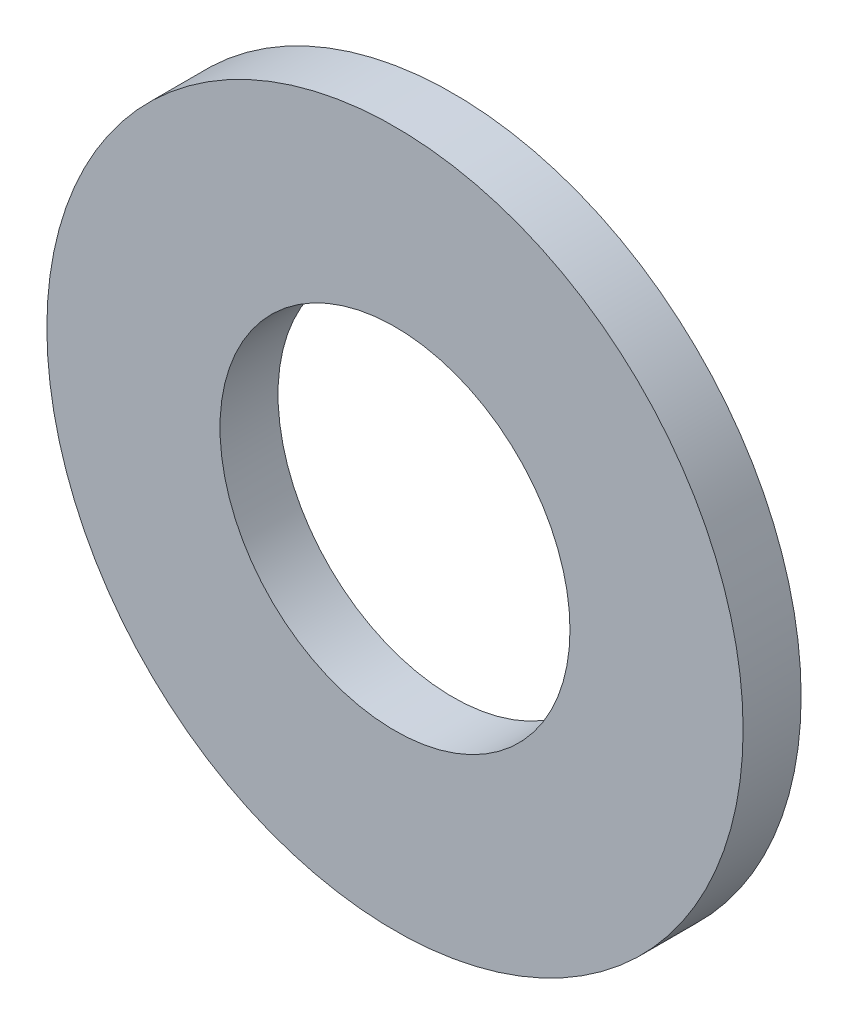
ISO-10303-21;
HEADER;
FILE_DESCRIPTION(('STEP AP214'),'2;1');
FILE_NAME('part.step','',(''),(''),'','','');
FILE_SCHEMA(('AUTOMOTIVE_DESIGN { 1 0 10303 214 1 1 1 1 }'));
ENDSEC;
DATA;
#1=APPLICATION_CONTEXT('core data for automotive mechanical design processes');
#2=APPLICATION_PROTOCOL_DEFINITION('international standard','automotive_design',2000,#1);
#3=PRODUCT_CONTEXT('',#1,'mechanical');
#4=PRODUCT('Part','Part','',(#3));
#5=PRODUCT_RELATED_PRODUCT_CATEGORY('part','',(#4));
#6=PRODUCT_DEFINITION_FORMATION('','',#4);
#7=PRODUCT_DEFINITION_CONTEXT('part definition',#1,'design');
#8=PRODUCT_DEFINITION('design','',#6,#7);
#9=PRODUCT_DEFINITION_SHAPE('','',#8);
#10=(LENGTH_UNIT() NAMED_UNIT(*) SI_UNIT(.MILLI.,.METRE.));
#11=(NAMED_UNIT(*) PLANE_ANGLE_UNIT() SI_UNIT($,.RADIAN.));
#12=(NAMED_UNIT(*) SI_UNIT($,.STERADIAN.) SOLID_ANGLE_UNIT());
#13=UNCERTAINTY_MEASURE_WITH_UNIT(LENGTH_MEASURE(1.E-05),#10,'distance_accuracy_value','');
#14=(GEOMETRIC_REPRESENTATION_CONTEXT(3) GLOBAL_UNCERTAINTY_ASSIGNED_CONTEXT((#13)) GLOBAL_UNIT_ASSIGNED_CONTEXT((#10,
#11,#12)) REPRESENTATION_CONTEXT('',''));
#15=CARTESIAN_POINT('',(0.,0.,0.));
#16=DIRECTION('',(0.,0.,1.));
#17=DIRECTION('',(1.,0.,0.));
#18=AXIS2_PLACEMENT_3D('',#15,#16,#17);
#19=CARTESIAN_POINT('',(0.,0.,0.79375));
#20=DIRECTION('',(0.,0.,1.));
#21=DIRECTION('',(1.,0.,0.));
#22=AXIS2_PLACEMENT_3D('',#19,#20,#21);
#23=PLANE('',#22);
#24=CARTESIAN_POINT('',(0.,0.,0.79375));
#25=DIRECTION('',(0.,0.,1.));
#26=DIRECTION('',(1.,0.,0.));
#27=AXIS2_PLACEMENT_3D('',#24,#25,#26);
#28=CIRCLE('',#27,9.525);
#29=CARTESIAN_POINT('',(9.525,0.,0.79375));
#30=VERTEX_POINT('',#29);
#31=EDGE_CURVE('E10',#30,#30,#28,.T.);
#32=ORIENTED_EDGE('',*,*,#31,.T.);
#33=EDGE_LOOP('',(#32));
#34=FACE_BOUND('',#33,.T.);
#35=CARTESIAN_POINT('',(0.,0.,0.79375));
#36=DIRECTION('',(0.,0.,1.));
#37=DIRECTION('',(1.,0.,0.));
#38=AXIS2_PLACEMENT_3D('',#35,#36,#37);
#39=CIRCLE('',#38,4.7879);
#40=CARTESIAN_POINT('',(4.7879,0.,0.79375));
#41=VERTEX_POINT('',#40);
#42=EDGE_CURVE('E42',#41,#41,#39,.T.);
#43=ORIENTED_EDGE('',*,*,#42,.F.);
#44=EDGE_LOOP('',(#43));
#45=FACE_BOUND('',#44,.T.);
#46=ADVANCED_FACE('F31',(#34,#45),#23,.T.);
#47=CARTESIAN_POINT('',(0.,0.,-0.79375));
#48=DIRECTION('',(0.,0.,1.));
#49=DIRECTION('',(1.,0.,0.));
#50=AXIS2_PLACEMENT_3D('',#47,#48,#49);
#51=PLANE('',#50);
#52=CARTESIAN_POINT('',(0.,0.,-0.79375));
#53=DIRECTION('',(0.,0.,1.));
#54=DIRECTION('',(1.,0.,0.));
#55=AXIS2_PLACEMENT_3D('',#52,#53,#54);
#56=CIRCLE('',#55,9.525);
#57=CARTESIAN_POINT('',(9.525,0.,-0.79375));
#58=VERTEX_POINT('',#57);
#59=EDGE_CURVE('E35',#58,#58,#56,.T.);
#60=ORIENTED_EDGE('',*,*,#59,.F.);
#61=EDGE_LOOP('',(#60));
#62=FACE_BOUND('',#61,.T.);
#63=CARTESIAN_POINT('',(0.,0.,-0.79375));
#64=DIRECTION('',(0.,0.,1.));
#65=DIRECTION('',(1.,0.,0.));
#66=AXIS2_PLACEMENT_3D('',#63,#64,#65);
#67=CIRCLE('',#66,4.7879);
#68=CARTESIAN_POINT('',(4.7879,0.,-0.79375));
#69=VERTEX_POINT('',#68);
#70=EDGE_CURVE('E44',#69,#69,#67,.T.);
#71=ORIENTED_EDGE('',*,*,#70,.T.);
#72=EDGE_LOOP('',(#71));
#73=FACE_BOUND('',#72,.T.);
#74=ADVANCED_FACE('F54',(#62,#73),#51,.F.);
#75=CARTESIAN_POINT('',(0.,0.,0.79375));
#76=DIRECTION('',(0.,0.,-1.));
#77=DIRECTION('',(-1.,0.,0.));
#78=AXIS2_PLACEMENT_3D('',#75,#76,#77);
#79=CYLINDRICAL_SURFACE('',#78,9.525);
#80=ORIENTED_EDGE('',*,*,#31,.F.);
#81=EDGE_LOOP('',(#80));
#82=FACE_BOUND('',#81,.T.);
#83=ORIENTED_EDGE('',*,*,#59,.T.);
#84=EDGE_LOOP('',(#83));
#85=FACE_BOUND('',#84,.T.);
#86=ADVANCED_FACE('F33',(#82,#85),#79,.T.);
#87=CARTESIAN_POINT('',(0.,0.,0.79375));
#88=DIRECTION('',(0.,0.,-1.));
#89=DIRECTION('',(-1.,0.,0.));
#90=AXIS2_PLACEMENT_3D('',#87,#88,#89);
#91=CYLINDRICAL_SURFACE('',#90,4.7879);
#92=ORIENTED_EDGE('',*,*,#42,.T.);
#93=EDGE_LOOP('',(#92));
#94=FACE_BOUND('',#93,.T.);
#95=ORIENTED_EDGE('',*,*,#70,.F.);
#96=EDGE_LOOP('',(#95));
#97=FACE_BOUND('',#96,.T.);
#98=ADVANCED_FACE('F50',(#94,#97),#91,.F.);
#99=CLOSED_SHELL('',(#46,#74,#86,#98));
#100=MANIFOLD_SOLID_BREP('B2',#99);
#101=ADVANCED_BREP_SHAPE_REPRESENTATION('',(#18,#100),#14);
#102=SHAPE_DEFINITION_REPRESENTATION(#9,#101);
ENDSEC;
END-ISO-10303-21;
